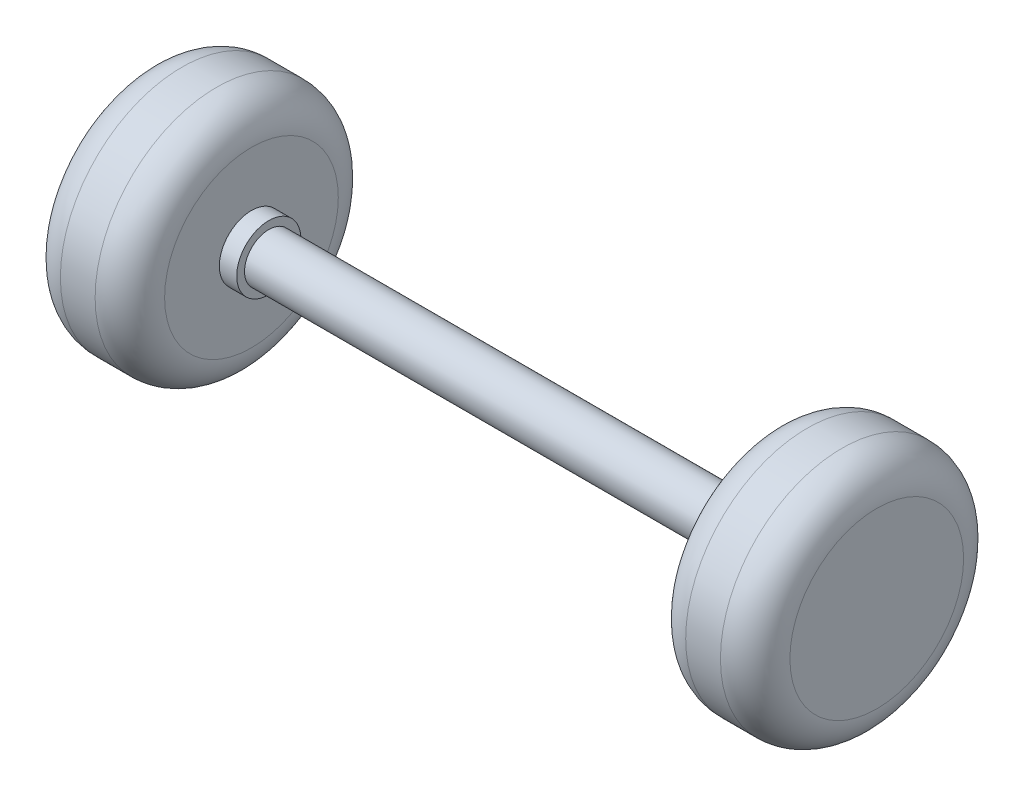
ISO-10303-21;
HEADER;
FILE_DESCRIPTION(('STEP AP214'),'2;1');
FILE_NAME('part.step','',(''),(''),'','','');
FILE_SCHEMA(('AUTOMOTIVE_DESIGN { 1 0 10303 214 1 1 1 1 }'));
ENDSEC;
DATA;
#1=APPLICATION_CONTEXT('core data for automotive mechanical design processes');
#2=APPLICATION_PROTOCOL_DEFINITION('international standard','automotive_design',2000,#1);
#3=PRODUCT_CONTEXT('',#1,'mechanical');
#4=PRODUCT('Part','Part','',(#3));
#5=PRODUCT_RELATED_PRODUCT_CATEGORY('part','',(#4));
#6=PRODUCT_DEFINITION_FORMATION('','',#4);
#7=PRODUCT_DEFINITION_CONTEXT('part definition',#1,'design');
#8=PRODUCT_DEFINITION('design','',#6,#7);
#9=PRODUCT_DEFINITION_SHAPE('','',#8);
#10=(LENGTH_UNIT() NAMED_UNIT(*) SI_UNIT(.MILLI.,.METRE.));
#11=(NAMED_UNIT(*) PLANE_ANGLE_UNIT() SI_UNIT($,.RADIAN.));
#12=(NAMED_UNIT(*) SI_UNIT($,.STERADIAN.) SOLID_ANGLE_UNIT());
#13=UNCERTAINTY_MEASURE_WITH_UNIT(LENGTH_MEASURE(1.E-05),#10,'distance_accuracy_value','');
#14=(GEOMETRIC_REPRESENTATION_CONTEXT(3) GLOBAL_UNCERTAINTY_ASSIGNED_CONTEXT((#13)) GLOBAL_UNIT_ASSIGNED_CONTEXT((#10,
#11,#12)) REPRESENTATION_CONTEXT('',''));
#15=CARTESIAN_POINT('',(0.,0.,0.));
#16=DIRECTION('',(0.,0.,1.));
#17=DIRECTION('',(1.,0.,0.));
#18=AXIS2_PLACEMENT_3D('',#15,#16,#17);
#19=CARTESIAN_POINT('',(-215.9,0.,0.));
#20=DIRECTION('',(-1.,0.,0.));
#21=DIRECTION('',(0.,0.,1.));
#22=AXIS2_PLACEMENT_3D('',#19,#20,#21);
#23=TOROIDAL_SURFACE('',#22,63.5,25.4);
#24=CARTESIAN_POINT('',(-215.9,0.,0.));
#25=DIRECTION('',(-1.,0.,0.));
#26=DIRECTION('',(0.,0.,1.));
#27=AXIS2_PLACEMENT_3D('',#24,#25,#26);
#28=CIRCLE('',#27,88.9);
#29=CARTESIAN_POINT('',(-215.9,0.,-88.9));
#30=VERTEX_POINT('',#29);
#31=EDGE_CURVE('E50',#30,#30,#28,.T.);
#32=ORIENTED_EDGE('',*,*,#31,.F.);
#33=EDGE_LOOP('',(#32));
#34=FACE_BOUND('',#33,.T.);
#35=CARTESIAN_POINT('',(-190.5,0.,0.));
#36=DIRECTION('',(-1.,0.,0.));
#37=DIRECTION('',(0.,0.,1.));
#38=AXIS2_PLACEMENT_3D('',#35,#36,#37);
#39=CIRCLE('',#38,63.5);
#40=CARTESIAN_POINT('',(-190.5,0.,63.5));
#41=VERTEX_POINT('',#40);
#42=EDGE_CURVE('E10',#41,#41,#39,.F.);
#43=ORIENTED_EDGE('',*,*,#42,.F.);
#44=EDGE_LOOP('',(#43));
#45=FACE_BOUND('',#44,.T.);
#46=ADVANCED_FACE('F43',(#34,#45),#23,.T.);
#47=CARTESIAN_POINT('',(-241.3,0.,0.));
#48=DIRECTION('',(-1.,0.,0.));
#49=DIRECTION('',(0.,0.,1.));
#50=AXIS2_PLACEMENT_3D('',#47,#48,#49);
#51=TOROIDAL_SURFACE('',#50,63.5,25.4);
#52=CARTESIAN_POINT('',(-266.7,0.,0.));
#53=DIRECTION('',(-1.,0.,0.));
#54=DIRECTION('',(0.,0.,1.));
#55=AXIS2_PLACEMENT_3D('',#52,#53,#54);
#56=CIRCLE('',#55,63.5);
#57=CARTESIAN_POINT('',(-266.7,0.,63.5));
#58=VERTEX_POINT('',#57);
#59=EDGE_CURVE('E60',#58,#58,#56,.T.);
#60=ORIENTED_EDGE('',*,*,#59,.F.);
#61=EDGE_LOOP('',(#60));
#62=FACE_BOUND('',#61,.T.);
#63=CARTESIAN_POINT('',(-241.3,0.,0.));
#64=DIRECTION('',(-1.,0.,0.));
#65=DIRECTION('',(0.,0.,1.));
#66=AXIS2_PLACEMENT_3D('',#63,#64,#65);
#67=CIRCLE('',#66,88.9);
#68=CARTESIAN_POINT('',(-241.3,0.,-88.9));
#69=VERTEX_POINT('',#68);
#70=EDGE_CURVE('E55',#69,#69,#67,.F.);
#71=ORIENTED_EDGE('',*,*,#70,.F.);
#72=EDGE_LOOP('',(#71));
#73=FACE_BOUND('',#72,.T.);
#74=ADVANCED_FACE('F122',(#62,#73),#51,.T.);
#75=CARTESIAN_POINT('',(215.9,0.,0.));
#76=DIRECTION('',(1.,0.,0.));
#77=DIRECTION('',(0.,0.,-1.));
#78=AXIS2_PLACEMENT_3D('',#75,#76,#77);
#79=TOROIDAL_SURFACE('',#78,63.5,25.4);
#80=CARTESIAN_POINT('',(215.9,0.,0.));
#81=DIRECTION('',(1.,0.,0.));
#82=DIRECTION('',(0.,0.,-1.));
#83=AXIS2_PLACEMENT_3D('',#80,#81,#82);
#84=CIRCLE('',#83,88.9);
#85=CARTESIAN_POINT('',(215.9,0.,88.9));
#86=VERTEX_POINT('',#85);
#87=EDGE_CURVE('E70',#86,#86,#84,.T.);
#88=ORIENTED_EDGE('',*,*,#87,.F.);
#89=EDGE_LOOP('',(#88));
#90=FACE_BOUND('',#89,.T.);
#91=CARTESIAN_POINT('',(190.5,0.,0.));
#92=DIRECTION('',(1.,0.,0.));
#93=DIRECTION('',(0.,0.,-1.));
#94=AXIS2_PLACEMENT_3D('',#91,#92,#93);
#95=CIRCLE('',#94,63.5);
#96=CARTESIAN_POINT('',(190.5,0.,-63.5));
#97=VERTEX_POINT('',#96);
#98=EDGE_CURVE('E66',#97,#97,#95,.F.);
#99=ORIENTED_EDGE('',*,*,#98,.F.);
#100=EDGE_LOOP('',(#99));
#101=FACE_BOUND('',#100,.T.);
#102=ADVANCED_FACE('F127',(#90,#101),#79,.T.);
#103=CARTESIAN_POINT('',(241.3,0.,0.));
#104=DIRECTION('',(1.,0.,0.));
#105=DIRECTION('',(0.,0.,-1.));
#106=AXIS2_PLACEMENT_3D('',#103,#104,#105);
#107=TOROIDAL_SURFACE('',#106,63.5,25.4);
#108=CARTESIAN_POINT('',(266.7,0.,0.));
#109=DIRECTION('',(1.,0.,0.));
#110=DIRECTION('',(0.,0.,-1.));
#111=AXIS2_PLACEMENT_3D('',#108,#109,#110);
#112=CIRCLE('',#111,63.5);
#113=CARTESIAN_POINT('',(266.7,0.,-63.5));
#114=VERTEX_POINT('',#113);
#115=EDGE_CURVE('E78',#114,#114,#112,.T.);
#116=ORIENTED_EDGE('',*,*,#115,.F.);
#117=EDGE_LOOP('',(#116));
#118=FACE_BOUND('',#117,.T.);
#119=CARTESIAN_POINT('',(241.3,0.,0.));
#120=DIRECTION('',(1.,0.,0.));
#121=DIRECTION('',(0.,0.,-1.));
#122=AXIS2_PLACEMENT_3D('',#119,#120,#121);
#123=CIRCLE('',#122,88.9);
#124=CARTESIAN_POINT('',(241.3,0.,88.9));
#125=VERTEX_POINT('',#124);
#126=EDGE_CURVE('E74',#125,#125,#123,.F.);
#127=ORIENTED_EDGE('',*,*,#126,.F.);
#128=EDGE_LOOP('',(#127));
#129=FACE_BOUND('',#128,.T.);
#130=ADVANCED_FACE('F133',(#118,#129),#107,.T.);
#131=CARTESIAN_POINT('',(177.8,0.,0.));
#132=DIRECTION('',(-1.,0.,0.));
#133=DIRECTION('',(0.,0.,1.));
#134=AXIS2_PLACEMENT_3D('',#131,#132,#133);
#135=CYLINDRICAL_SURFACE('',#134,17.78);
#136=CARTESIAN_POINT('',(177.8,0.,0.));
#137=DIRECTION('',(1.,0.,0.));
#138=DIRECTION('',(0.,0.,-1.));
#139=AXIS2_PLACEMENT_3D('',#136,#137,#138);
#140=CIRCLE('',#139,17.78);
#141=CARTESIAN_POINT('',(177.8,0.,-17.78));
#142=VERTEX_POINT('',#141);
#143=EDGE_CURVE('E82',#142,#142,#140,.T.);
#144=ORIENTED_EDGE('',*,*,#143,.F.);
#145=EDGE_LOOP('',(#144));
#146=FACE_BOUND('',#145,.T.);
#147=CARTESIAN_POINT('',(-177.8,0.,0.));
#148=DIRECTION('',(1.,0.,0.));
#149=DIRECTION('',(0.,0.,-1.));
#150=AXIS2_PLACEMENT_3D('',#147,#148,#149);
#151=CIRCLE('',#150,17.78);
#152=CARTESIAN_POINT('',(-177.8,0.,-17.78));
#153=VERTEX_POINT('',#152);
#154=EDGE_CURVE('E83',#153,#153,#151,.T.);
#155=ORIENTED_EDGE('',*,*,#154,.T.);
#156=EDGE_LOOP('',(#155));
#157=FACE_BOUND('',#156,.T.);
#158=ADVANCED_FACE('F141',(#146,#157),#135,.T.);
#159=CARTESIAN_POINT('',(190.5,0.,0.));
#160=DIRECTION('',(-1.,0.,0.));
#161=DIRECTION('',(0.,0.,1.));
#162=AXIS2_PLACEMENT_3D('',#159,#160,#161);
#163=CYLINDRICAL_SURFACE('',#162,23.495);
#164=CARTESIAN_POINT('',(190.5,0.,0.));
#165=DIRECTION('',(1.,0.,0.));
#166=DIRECTION('',(0.,0.,-1.));
#167=AXIS2_PLACEMENT_3D('',#164,#165,#166);
#168=CIRCLE('',#167,23.495);
#169=CARTESIAN_POINT('',(190.5,0.,-23.495));
#170=VERTEX_POINT('',#169);
#171=EDGE_CURVE('E92',#170,#170,#168,.T.);
#172=ORIENTED_EDGE('',*,*,#171,.F.);
#173=EDGE_LOOP('',(#172));
#174=FACE_BOUND('',#173,.T.);
#175=CARTESIAN_POINT('',(177.8,0.,0.));
#176=DIRECTION('',(1.,0.,0.));
#177=DIRECTION('',(0.,0.,-1.));
#178=AXIS2_PLACEMENT_3D('',#175,#176,#177);
#179=CIRCLE('',#178,23.495);
#180=CARTESIAN_POINT('',(177.8,0.,-23.495));
#181=VERTEX_POINT('',#180);
#182=EDGE_CURVE('E87',#181,#181,#179,.T.);
#183=ORIENTED_EDGE('',*,*,#182,.T.);
#184=EDGE_LOOP('',(#183));
#185=FACE_BOUND('',#184,.T.);
#186=ADVANCED_FACE('F145',(#174,#185),#163,.T.);
#187=CARTESIAN_POINT('',(177.8,0.,0.));
#188=DIRECTION('',(1.,0.,0.));
#189=DIRECTION('',(0.,0.,-1.));
#190=AXIS2_PLACEMENT_3D('',#187,#188,#189);
#191=PLANE('',#190);
#192=ORIENTED_EDGE('',*,*,#143,.T.);
#193=EDGE_LOOP('',(#192));
#194=FACE_BOUND('',#193,.T.);
#195=ORIENTED_EDGE('',*,*,#182,.F.);
#196=EDGE_LOOP('',(#195));
#197=FACE_BOUND('',#196,.T.);
#198=ADVANCED_FACE('F149',(#194,#197),#191,.F.);
#199=CARTESIAN_POINT('',(-190.5,0.,0.));
#200=DIRECTION('',(1.,0.,0.));
#201=DIRECTION('',(0.,0.,-1.));
#202=AXIS2_PLACEMENT_3D('',#199,#200,#201);
#203=CYLINDRICAL_SURFACE('',#202,23.495);
#204=CARTESIAN_POINT('',(-190.5,0.,0.));
#205=DIRECTION('',(1.,0.,0.));
#206=DIRECTION('',(0.,0.,-1.));
#207=AXIS2_PLACEMENT_3D('',#204,#205,#206);
#208=CIRCLE('',#207,23.495);
#209=CARTESIAN_POINT('',(-190.5,0.,-23.495));
#210=VERTEX_POINT('',#209);
#211=EDGE_CURVE('E102',#210,#210,#208,.T.);
#212=ORIENTED_EDGE('',*,*,#211,.T.);
#213=EDGE_LOOP('',(#212));
#214=FACE_BOUND('',#213,.T.);
#215=CARTESIAN_POINT('',(-177.8,0.,0.));
#216=DIRECTION('',(1.,0.,0.));
#217=DIRECTION('',(0.,0.,-1.));
#218=AXIS2_PLACEMENT_3D('',#215,#216,#217);
#219=CIRCLE('',#218,23.495);
#220=CARTESIAN_POINT('',(-177.8,0.,-23.495));
#221=VERTEX_POINT('',#220);
#222=EDGE_CURVE('E88',#221,#221,#219,.T.);
#223=ORIENTED_EDGE('',*,*,#222,.F.);
#224=EDGE_LOOP('',(#223));
#225=FACE_BOUND('',#224,.T.);
#226=ADVANCED_FACE('F107',(#214,#225),#203,.T.);
#227=CARTESIAN_POINT('',(-177.8,0.,0.));
#228=DIRECTION('',(-1.,0.,0.));
#229=DIRECTION('',(0.,0.,-1.));
#230=AXIS2_PLACEMENT_3D('',#227,#228,#229);
#231=PLANE('',#230);
#232=ORIENTED_EDGE('',*,*,#154,.F.);
#233=EDGE_LOOP('',(#232));
#234=FACE_BOUND('',#233,.T.);
#235=ORIENTED_EDGE('',*,*,#222,.T.);
#236=EDGE_LOOP('',(#235));
#237=FACE_BOUND('',#236,.T.);
#238=ADVANCED_FACE('F156',(#234,#237),#231,.F.);
#239=CARTESIAN_POINT('',(266.7,0.,0.));
#240=DIRECTION('',(-1.,0.,0.));
#241=DIRECTION('',(0.,0.,1.));
#242=AXIS2_PLACEMENT_3D('',#239,#240,#241);
#243=CYLINDRICAL_SURFACE('',#242,88.9);
#244=CARTESIAN_POINT('',(215.9,0.,88.9));
#245=CARTESIAN_POINT('',(216.164583333333,0.,88.9));
#246=CARTESIAN_POINT('',(216.429166666667,0.,88.9));
#247=CARTESIAN_POINT('',(216.958333333333,0.,88.9));
#248=CARTESIAN_POINT('',(217.222916666667,0.,88.9));
#249=CARTESIAN_POINT('',(217.752083333333,0.,88.9));
#250=CARTESIAN_POINT('',(218.016666666667,0.,88.9));
#251=CARTESIAN_POINT('',(218.545833333333,0.,88.9));
#252=CARTESIAN_POINT('',(218.810416666667,0.,88.9));
#253=CARTESIAN_POINT('',(219.339583333333,0.,88.9));
#254=CARTESIAN_POINT('',(219.604166666667,0.,88.9));
#255=CARTESIAN_POINT('',(220.133333333333,0.,88.9));
#256=CARTESIAN_POINT('',(220.397916666667,0.,88.9));
#257=CARTESIAN_POINT('',(220.927083333333,0.,88.9));
#258=CARTESIAN_POINT('',(221.191666666667,0.,88.9));
#259=CARTESIAN_POINT('',(221.720833333333,0.,88.9));
#260=CARTESIAN_POINT('',(221.985416666667,0.,88.9));
#261=CARTESIAN_POINT('',(222.514583333333,0.,88.9));
#262=CARTESIAN_POINT('',(222.779166666667,0.,88.9));
#263=CARTESIAN_POINT('',(223.308333333333,0.,88.9));
#264=CARTESIAN_POINT('',(223.572916666667,0.,88.9));
#265=CARTESIAN_POINT('',(224.102083333333,0.,88.9));
#266=CARTESIAN_POINT('',(224.366666666667,0.,88.9));
#267=CARTESIAN_POINT('',(224.895833333333,0.,88.9));
#268=CARTESIAN_POINT('',(225.160416666667,0.,88.9));
#269=CARTESIAN_POINT('',(225.689583333333,0.,88.9));
#270=CARTESIAN_POINT('',(225.954166666667,0.,88.9));
#271=CARTESIAN_POINT('',(226.483333333333,0.,88.9));
#272=CARTESIAN_POINT('',(226.747916666667,0.,88.9));
#273=CARTESIAN_POINT('',(227.277083333333,0.,88.9));
#274=CARTESIAN_POINT('',(227.541666666667,0.,88.9));
#275=CARTESIAN_POINT('',(228.070833333333,0.,88.9));
#276=CARTESIAN_POINT('',(228.335416666667,0.,88.9));
#277=CARTESIAN_POINT('',(228.864583333333,0.,88.9));
#278=CARTESIAN_POINT('',(229.129166666667,0.,88.9));
#279=CARTESIAN_POINT('',(229.658333333333,0.,88.9));
#280=CARTESIAN_POINT('',(229.922916666667,0.,88.9));
#281=CARTESIAN_POINT('',(230.452083333333,0.,88.9));
#282=CARTESIAN_POINT('',(230.716666666667,0.,88.9));
#283=CARTESIAN_POINT('',(231.245833333333,0.,88.9));
#284=CARTESIAN_POINT('',(231.510416666667,0.,88.9));
#285=CARTESIAN_POINT('',(232.039583333333,0.,88.9));
#286=CARTESIAN_POINT('',(232.304166666667,0.,88.9));
#287=CARTESIAN_POINT('',(232.833333333333,0.,88.9));
#288=CARTESIAN_POINT('',(233.097916666667,0.,88.9));
#289=CARTESIAN_POINT('',(233.627083333333,0.,88.9));
#290=CARTESIAN_POINT('',(233.891666666667,0.,88.9));
#291=CARTESIAN_POINT('',(234.420833333333,0.,88.9));
#292=CARTESIAN_POINT('',(234.685416666667,0.,88.9));
#293=CARTESIAN_POINT('',(235.214583333333,0.,88.9));
#294=CARTESIAN_POINT('',(235.479166666667,0.,88.9));
#295=CARTESIAN_POINT('',(236.008333333333,0.,88.9));
#296=CARTESIAN_POINT('',(236.272916666667,0.,88.9));
#297=CARTESIAN_POINT('',(236.802083333333,0.,88.9));
#298=CARTESIAN_POINT('',(237.066666666667,0.,88.9));
#299=CARTESIAN_POINT('',(237.595833333333,0.,88.9));
#300=CARTESIAN_POINT('',(237.860416666667,0.,88.9));
#301=CARTESIAN_POINT('',(238.389583333333,0.,88.9));
#302=CARTESIAN_POINT('',(238.654166666667,0.,88.9));
#303=CARTESIAN_POINT('',(239.183333333333,0.,88.9));
#304=CARTESIAN_POINT('',(239.447916666667,0.,88.9));
#305=CARTESIAN_POINT('',(239.977083333333,0.,88.9));
#306=CARTESIAN_POINT('',(240.241666666667,0.,88.9));
#307=CARTESIAN_POINT('',(240.770833333333,0.,88.9));
#308=CARTESIAN_POINT('',(241.035416666667,0.,88.9));
#309=CARTESIAN_POINT('',(241.3,0.,88.9));
#310=B_SPLINE_CURVE_WITH_KNOTS('',3,(#244,#245,#246,#247,#248,#249,#250,#251,#252,#253,#254,
#255,#256,#257,#258,#259,#260,#261,#262,#263,#264,#265,#266,#267,#268,#269,#270,#271,#272,#273,
#274,#275,#276,#277,#278,#279,#280,#281,#282,#283,#284,#285,#286,#287,#288,#289,#290,#291,#292,
#293,#294,#295,#296,#297,#298,#299,#300,#301,#302,#303,#304,#305,#306,#307,#308,#309),
.UNSPECIFIED.,.F.,.F.,(4,2,2,2,2,2,2,2,2,2,2,2,2,2,2,2,2,2,2,2,2,2,2,2,2,2,2,2,2,2,2,2,4),(0.,
0.79375000000001,1.58749999999999,2.38125,3.17500000000001,3.96875000000002,4.7625,
5.55625000000001,6.35000000000002,7.14375,7.93750000000001,8.73125000000002,9.52500000000001,
10.31875,11.1125,11.90625,12.7,13.49375,14.2875,15.08125,15.875,16.66875,17.4625,18.25625,19.05,
19.84375,20.6375,21.43125,22.225,23.01875,23.8125,24.60625,25.4),.UNSPECIFIED.);
#311=EDGE_CURVE('BSEAM159',#86,#125,#310,.T.);
#312=ORIENTED_EDGE('',*,*,#87,.T.);
#313=ORIENTED_EDGE('',*,*,#126,.T.);
#314=ORIENTED_EDGE('',*,*,#311,.T.);
#315=ORIENTED_EDGE('',*,*,#311,.F.);
#316=EDGE_LOOP('',(#312,#314,#313,#315));
#317=FACE_BOUND('',#316,.T.);
#318=ADVANCED_FACE('F159',(#317),#243,.T.);
#319=CARTESIAN_POINT('',(266.7,0.,0.));
#320=DIRECTION('',(1.,0.,0.));
#321=DIRECTION('',(0.,0.,-1.));
#322=AXIS2_PLACEMENT_3D('',#319,#320,#321);
#323=PLANE('',#322);
#324=ORIENTED_EDGE('',*,*,#115,.T.);
#325=EDGE_LOOP('',(#324));
#326=FACE_BOUND('',#325,.T.);
#327=ADVANCED_FACE('F163',(#326),#323,.T.);
#328=CARTESIAN_POINT('',(190.5,0.,0.));
#329=DIRECTION('',(1.,0.,0.));
#330=DIRECTION('',(0.,0.,-1.));
#331=AXIS2_PLACEMENT_3D('',#328,#329,#330);
#332=PLANE('',#331);
#333=ORIENTED_EDGE('',*,*,#98,.T.);
#334=EDGE_LOOP('',(#333));
#335=FACE_BOUND('',#334,.T.);
#336=ORIENTED_EDGE('',*,*,#171,.T.);
#337=EDGE_LOOP('',(#336));
#338=FACE_BOUND('',#337,.T.);
#339=ADVANCED_FACE('F165',(#335,#338),#332,.F.);
#340=CARTESIAN_POINT('',(-266.7,0.,0.));
#341=DIRECTION('',(1.,0.,0.));
#342=DIRECTION('',(0.,0.,-1.));
#343=AXIS2_PLACEMENT_3D('',#340,#341,#342);
#344=CYLINDRICAL_SURFACE('',#343,88.9);
#345=CARTESIAN_POINT('',(-215.9,0.,-88.9));
#346=CARTESIAN_POINT('',(-216.164583333333,0.,-88.9));
#347=CARTESIAN_POINT('',(-216.429166666667,0.,-88.9));
#348=CARTESIAN_POINT('',(-216.958333333333,0.,-88.9));
#349=CARTESIAN_POINT('',(-217.222916666667,0.,-88.9));
#350=CARTESIAN_POINT('',(-217.752083333333,0.,-88.9));
#351=CARTESIAN_POINT('',(-218.016666666667,0.,-88.9));
#352=CARTESIAN_POINT('',(-218.545833333333,0.,-88.9));
#353=CARTESIAN_POINT('',(-218.810416666667,0.,-88.9));
#354=CARTESIAN_POINT('',(-219.339583333333,0.,-88.9));
#355=CARTESIAN_POINT('',(-219.604166666667,0.,-88.9));
#356=CARTESIAN_POINT('',(-220.133333333333,0.,-88.9));
#357=CARTESIAN_POINT('',(-220.397916666667,0.,-88.9));
#358=CARTESIAN_POINT('',(-220.927083333333,0.,-88.9));
#359=CARTESIAN_POINT('',(-221.191666666667,0.,-88.9));
#360=CARTESIAN_POINT('',(-221.720833333333,0.,-88.9));
#361=CARTESIAN_POINT('',(-221.985416666667,0.,-88.9));
#362=CARTESIAN_POINT('',(-222.514583333333,0.,-88.9));
#363=CARTESIAN_POINT('',(-222.779166666667,0.,-88.9));
#364=CARTESIAN_POINT('',(-223.308333333333,0.,-88.9));
#365=CARTESIAN_POINT('',(-223.572916666667,0.,-88.9));
#366=CARTESIAN_POINT('',(-224.102083333333,0.,-88.9));
#367=CARTESIAN_POINT('',(-224.366666666667,0.,-88.9));
#368=CARTESIAN_POINT('',(-224.895833333333,0.,-88.9));
#369=CARTESIAN_POINT('',(-225.160416666667,0.,-88.9));
#370=CARTESIAN_POINT('',(-225.689583333333,0.,-88.9));
#371=CARTESIAN_POINT('',(-225.954166666667,0.,-88.9));
#372=CARTESIAN_POINT('',(-226.483333333333,0.,-88.9));
#373=CARTESIAN_POINT('',(-226.747916666667,0.,-88.9));
#374=CARTESIAN_POINT('',(-227.277083333333,0.,-88.9));
#375=CARTESIAN_POINT('',(-227.541666666667,0.,-88.9));
#376=CARTESIAN_POINT('',(-228.070833333333,0.,-88.9));
#377=CARTESIAN_POINT('',(-228.335416666667,0.,-88.9));
#378=CARTESIAN_POINT('',(-228.864583333333,0.,-88.9));
#379=CARTESIAN_POINT('',(-229.129166666667,0.,-88.9));
#380=CARTESIAN_POINT('',(-229.658333333333,0.,-88.9));
#381=CARTESIAN_POINT('',(-229.922916666667,0.,-88.9));
#382=CARTESIAN_POINT('',(-230.452083333333,0.,-88.9));
#383=CARTESIAN_POINT('',(-230.716666666667,0.,-88.9));
#384=CARTESIAN_POINT('',(-231.245833333333,0.,-88.9));
#385=CARTESIAN_POINT('',(-231.510416666667,0.,-88.9));
#386=CARTESIAN_POINT('',(-232.039583333333,0.,-88.9));
#387=CARTESIAN_POINT('',(-232.304166666667,0.,-88.9));
#388=CARTESIAN_POINT('',(-232.833333333333,0.,-88.9));
#389=CARTESIAN_POINT('',(-233.097916666667,0.,-88.9));
#390=CARTESIAN_POINT('',(-233.627083333333,0.,-88.9));
#391=CARTESIAN_POINT('',(-233.891666666667,0.,-88.9));
#392=CARTESIAN_POINT('',(-234.420833333333,0.,-88.9));
#393=CARTESIAN_POINT('',(-234.685416666667,0.,-88.9));
#394=CARTESIAN_POINT('',(-235.214583333333,0.,-88.9));
#395=CARTESIAN_POINT('',(-235.479166666667,0.,-88.9));
#396=CARTESIAN_POINT('',(-236.008333333333,0.,-88.9));
#397=CARTESIAN_POINT('',(-236.272916666667,0.,-88.9));
#398=CARTESIAN_POINT('',(-236.802083333333,0.,-88.9));
#399=CARTESIAN_POINT('',(-237.066666666667,0.,-88.9));
#400=CARTESIAN_POINT('',(-237.595833333333,0.,-88.9));
#401=CARTESIAN_POINT('',(-237.860416666667,0.,-88.9));
#402=CARTESIAN_POINT('',(-238.389583333333,0.,-88.9));
#403=CARTESIAN_POINT('',(-238.654166666667,0.,-88.9));
#404=CARTESIAN_POINT('',(-239.183333333333,0.,-88.9));
#405=CARTESIAN_POINT('',(-239.447916666667,0.,-88.9));
#406=CARTESIAN_POINT('',(-239.977083333333,0.,-88.9));
#407=CARTESIAN_POINT('',(-240.241666666667,0.,-88.9));
#408=CARTESIAN_POINT('',(-240.770833333333,0.,-88.9));
#409=CARTESIAN_POINT('',(-241.035416666667,0.,-88.9));
#410=CARTESIAN_POINT('',(-241.3,0.,-88.9));
#411=B_SPLINE_CURVE_WITH_KNOTS('',3,(#345,#346,#347,#348,#349,#350,#351,#352,#353,#354,#355,
#356,#357,#358,#359,#360,#361,#362,#363,#364,#365,#366,#367,#368,#369,#370,#371,#372,#373,#374,
#375,#376,#377,#378,#379,#380,#381,#382,#383,#384,#385,#386,#387,#388,#389,#390,#391,#392,#393,
#394,#395,#396,#397,#398,#399,#400,#401,#402,#403,#404,#405,#406,#407,#408,#409,#410),
.UNSPECIFIED.,.F.,.F.,(4,2,2,2,2,2,2,2,2,2,2,2,2,2,2,2,2,2,2,2,2,2,2,2,2,2,2,2,2,2,2,2,4),(0.,
0.79375000000001,1.58749999999999,2.38125,3.17500000000001,3.96875000000002,4.7625,
5.55625000000001,6.35000000000002,7.14375,7.93750000000001,8.73125000000002,9.52500000000001,
10.31875,11.1125,11.90625,12.7,13.49375,14.2875,15.08125,15.875,16.66875,17.4625,18.25625,19.05,
19.84375,20.6375,21.43125,22.225,23.01875,23.8125,24.60625,25.4),.UNSPECIFIED.);
#412=EDGE_CURVE('BSEAM117',#30,#69,#411,.T.);
#413=ORIENTED_EDGE('',*,*,#31,.T.);
#414=ORIENTED_EDGE('',*,*,#70,.T.);
#415=ORIENTED_EDGE('',*,*,#412,.T.);
#416=ORIENTED_EDGE('',*,*,#412,.F.);
#417=EDGE_LOOP('',(#413,#415,#414,#416));
#418=FACE_BOUND('',#417,.T.);
#419=ADVANCED_FACE('F117',(#418),#344,.T.);
#420=CARTESIAN_POINT('',(-266.7,0.,0.));
#421=DIRECTION('',(-1.,0.,0.));
#422=DIRECTION('',(0.,0.,-1.));
#423=AXIS2_PLACEMENT_3D('',#420,#421,#422);
#424=PLANE('',#423);
#425=ORIENTED_EDGE('',*,*,#59,.T.);
#426=EDGE_LOOP('',(#425));
#427=FACE_BOUND('',#426,.T.);
#428=ADVANCED_FACE('F112',(#427),#424,.T.);
#429=CARTESIAN_POINT('',(-190.5,0.,0.));
#430=DIRECTION('',(-1.,0.,0.));
#431=DIRECTION('',(0.,0.,-1.));
#432=AXIS2_PLACEMENT_3D('',#429,#430,#431);
#433=PLANE('',#432);
#434=ORIENTED_EDGE('',*,*,#42,.T.);
#435=EDGE_LOOP('',(#434));
#436=FACE_BOUND('',#435,.T.);
#437=ORIENTED_EDGE('',*,*,#211,.F.);
#438=EDGE_LOOP('',(#437));
#439=FACE_BOUND('',#438,.T.);
#440=ADVANCED_FACE('F110',(#436,#439),#433,.F.);
#441=CLOSED_SHELL('',(#46,#74,#102,#130,#158,#186,#198,#226,#238,#318,#327,#339,#419,#428,#440));
#442=MANIFOLD_SOLID_BREP('B2',#441);
#443=ADVANCED_BREP_SHAPE_REPRESENTATION('',(#18,#442),#14);
#444=SHAPE_DEFINITION_REPRESENTATION(#9,#443);
ENDSEC;
END-ISO-10303-21;
